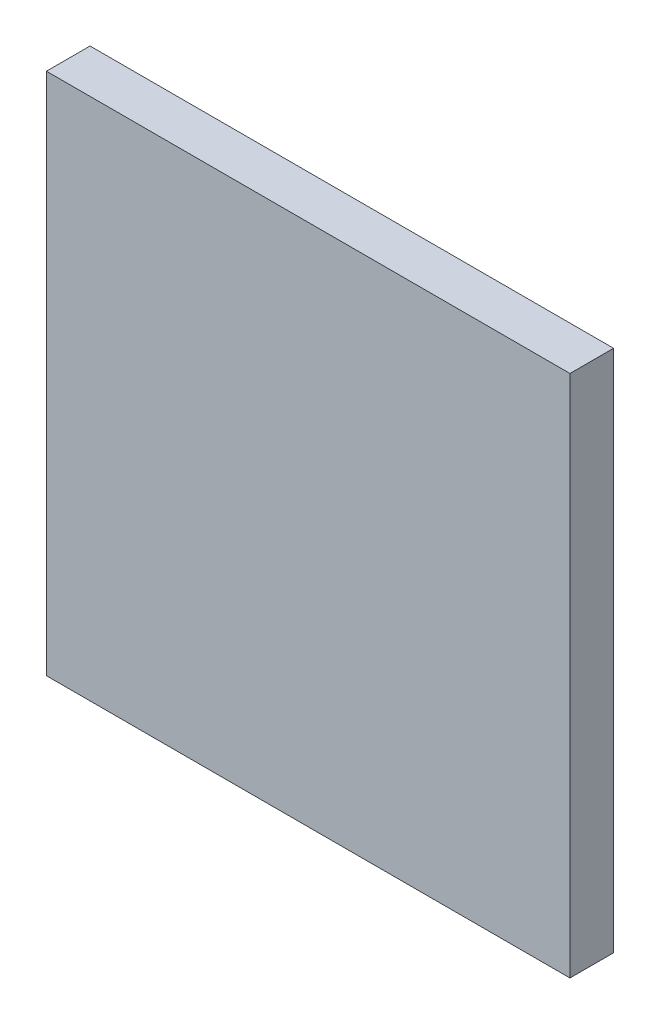
ISO-10303-21;
HEADER;
FILE_DESCRIPTION(('STEP AP214'),'2;1');
FILE_NAME('part.step','',(''),(''),'','','');
FILE_SCHEMA(('AUTOMOTIVE_DESIGN { 1 0 10303 214 1 1 1 1 }'));
ENDSEC;
DATA;
#1=APPLICATION_CONTEXT('core data for automotive mechanical design processes');
#2=APPLICATION_PROTOCOL_DEFINITION('international standard','automotive_design',2000,#1);
#3=PRODUCT_CONTEXT('',#1,'mechanical');
#4=PRODUCT('Part','Part','',(#3));
#5=PRODUCT_RELATED_PRODUCT_CATEGORY('part','',(#4));
#6=PRODUCT_DEFINITION_FORMATION('','',#4);
#7=PRODUCT_DEFINITION_CONTEXT('part definition',#1,'design');
#8=PRODUCT_DEFINITION('design','',#6,#7);
#9=PRODUCT_DEFINITION_SHAPE('','',#8);
#10=(LENGTH_UNIT() NAMED_UNIT(*) SI_UNIT(.MILLI.,.METRE.));
#11=(NAMED_UNIT(*) PLANE_ANGLE_UNIT() SI_UNIT($,.RADIAN.));
#12=(NAMED_UNIT(*) SI_UNIT($,.STERADIAN.) SOLID_ANGLE_UNIT());
#13=UNCERTAINTY_MEASURE_WITH_UNIT(LENGTH_MEASURE(1.E-05),#10,'distance_accuracy_value','');
#14=(GEOMETRIC_REPRESENTATION_CONTEXT(3) GLOBAL_UNCERTAINTY_ASSIGNED_CONTEXT((#13)) GLOBAL_UNIT_ASSIGNED_CONTEXT((#10,
#11,#12)) REPRESENTATION_CONTEXT('',''));
#15=CARTESIAN_POINT('',(0.,0.,0.));
#16=DIRECTION('',(0.,0.,1.));
#17=DIRECTION('',(1.,0.,0.));
#18=AXIS2_PLACEMENT_3D('',#15,#16,#17);
#19=CARTESIAN_POINT('',(0.,0.,10000.));
#20=DIRECTION('',(1.,0.,0.));
#21=DIRECTION('',(0.,0.,-1.));
#22=AXIS2_PLACEMENT_3D('',#19,#20,#21);
#23=PLANE('',#22);
#24=DIRECTION('',(0.,-1.,0.));
#25=VECTOR('',#24,1.);
#26=CARTESIAN_POINT('',(0.,0.,0.));
#27=LINE('',#26,#25);
#28=CARTESIAN_POINT('',(0.,120000.,0.));
#29=VERTEX_POINT('',#28);
#30=CARTESIAN_POINT('',(0.,0.,0.));
#31=VERTEX_POINT('',#30);
#32=EDGE_CURVE('E111',#29,#31,#27,.T.);
#33=ORIENTED_EDGE('',*,*,#32,.T.);
#34=DIRECTION('',(0.,0.,-1.));
#35=VECTOR('',#34,1.);
#36=CARTESIAN_POINT('',(0.,0.,10000.));
#37=LINE('',#36,#35);
#38=CARTESIAN_POINT('',(0.,0.,10000.));
#39=VERTEX_POINT('',#38);
#40=EDGE_CURVE('E11',#39,#31,#37,.T.);
#41=ORIENTED_EDGE('',*,*,#40,.F.);
#42=DIRECTION('',(0.,-1.,0.));
#43=VECTOR('',#42,1.);
#44=CARTESIAN_POINT('',(0.,0.,10000.));
#45=LINE('',#44,#43);
#46=CARTESIAN_POINT('',(0.,120000.,10000.));
#47=VERTEX_POINT('',#46);
#48=EDGE_CURVE('E95',#47,#39,#45,.T.);
#49=ORIENTED_EDGE('',*,*,#48,.F.);
#50=DIRECTION('',(0.,0.,-1.));
#51=VECTOR('',#50,1.);
#52=CARTESIAN_POINT('',(0.,120000.,10000.));
#53=LINE('',#52,#51);
#54=EDGE_CURVE('E107',#47,#29,#53,.T.);
#55=ORIENTED_EDGE('',*,*,#54,.T.);
#56=EDGE_LOOP('',(#33,#41,#49,#55));
#57=FACE_BOUND('',#56,.T.);
#58=ADVANCED_FACE('F43',(#57),#23,.F.);
#59=CARTESIAN_POINT('',(0.,0.,10000.));
#60=DIRECTION('',(0.,1.,0.));
#61=DIRECTION('',(0.,0.,1.));
#62=AXIS2_PLACEMENT_3D('',#59,#60,#61);
#63=PLANE('',#62);
#64=DIRECTION('',(1.,0.,0.));
#65=VECTOR('',#64,1.);
#66=CARTESIAN_POINT('',(0.,0.,0.));
#67=LINE('',#66,#65);
#68=CARTESIAN_POINT('',(120000.,0.,0.));
#69=VERTEX_POINT('',#68);
#70=EDGE_CURVE('E100',#31,#69,#67,.T.);
#71=ORIENTED_EDGE('',*,*,#70,.T.);
#72=DIRECTION('',(0.,0.,-1.));
#73=VECTOR('',#72,1.);
#74=CARTESIAN_POINT('',(120000.,0.,10000.));
#75=LINE('',#74,#73);
#76=CARTESIAN_POINT('',(120000.,0.,10000.));
#77=VERTEX_POINT('',#76);
#78=EDGE_CURVE('E52',#77,#69,#75,.T.);
#79=ORIENTED_EDGE('',*,*,#78,.F.);
#80=DIRECTION('',(1.,0.,0.));
#81=VECTOR('',#80,1.);
#82=CARTESIAN_POINT('',(0.,0.,10000.));
#83=LINE('',#82,#81);
#84=EDGE_CURVE('E90',#39,#77,#83,.T.);
#85=ORIENTED_EDGE('',*,*,#84,.F.);
#86=ORIENTED_EDGE('',*,*,#40,.T.);
#87=EDGE_LOOP('',(#71,#79,#85,#86));
#88=FACE_BOUND('',#87,.T.);
#89=ADVANCED_FACE('F99',(#88),#63,.F.);
#90=CARTESIAN_POINT('',(120000.,0.,10000.));
#91=DIRECTION('',(-1.,0.,0.));
#92=DIRECTION('',(0.,0.,1.));
#93=AXIS2_PLACEMENT_3D('',#90,#91,#92);
#94=PLANE('',#93);
#95=DIRECTION('',(0.,1.,0.));
#96=VECTOR('',#95,1.);
#97=CARTESIAN_POINT('',(120000.,0.,0.));
#98=LINE('',#97,#96);
#99=CARTESIAN_POINT('',(120000.,120000.,0.));
#100=VERTEX_POINT('',#99);
#101=EDGE_CURVE('E77',#69,#100,#98,.T.);
#102=ORIENTED_EDGE('',*,*,#101,.T.);
#103=DIRECTION('',(0.,0.,-1.));
#104=VECTOR('',#103,1.);
#105=CARTESIAN_POINT('',(120000.,120000.,10000.));
#106=LINE('',#105,#104);
#107=CARTESIAN_POINT('',(120000.,120000.,10000.));
#108=VERTEX_POINT('',#107);
#109=EDGE_CURVE('E102',#108,#100,#106,.T.);
#110=ORIENTED_EDGE('',*,*,#109,.F.);
#111=DIRECTION('',(0.,1.,0.));
#112=VECTOR('',#111,1.);
#113=CARTESIAN_POINT('',(120000.,0.,10000.));
#114=LINE('',#113,#112);
#115=EDGE_CURVE('E93',#77,#108,#114,.T.);
#116=ORIENTED_EDGE('',*,*,#115,.F.);
#117=ORIENTED_EDGE('',*,*,#78,.T.);
#118=EDGE_LOOP('',(#102,#110,#116,#117));
#119=FACE_BOUND('',#118,.T.);
#120=ADVANCED_FACE('F103',(#119),#94,.F.);
#121=CARTESIAN_POINT('',(0.,120000.,10000.));
#122=DIRECTION('',(0.,-1.,0.));
#123=DIRECTION('',(0.,0.,-1.));
#124=AXIS2_PLACEMENT_3D('',#121,#122,#123);
#125=PLANE('',#124);
#126=DIRECTION('',(-1.,0.,0.));
#127=VECTOR('',#126,1.);
#128=CARTESIAN_POINT('',(0.,120000.,0.));
#129=LINE('',#128,#127);
#130=EDGE_CURVE('E83',#100,#29,#129,.T.);
#131=ORIENTED_EDGE('',*,*,#130,.T.);
#132=ORIENTED_EDGE('',*,*,#54,.F.);
#133=DIRECTION('',(-1.,0.,0.));
#134=VECTOR('',#133,1.);
#135=CARTESIAN_POINT('',(0.,120000.,10000.));
#136=LINE('',#135,#134);
#137=EDGE_CURVE('E60',#108,#47,#136,.T.);
#138=ORIENTED_EDGE('',*,*,#137,.F.);
#139=ORIENTED_EDGE('',*,*,#109,.T.);
#140=EDGE_LOOP('',(#131,#132,#138,#139));
#141=FACE_BOUND('',#140,.T.);
#142=ADVANCED_FACE('F124',(#141),#125,.F.);
#143=CARTESIAN_POINT('',(0.,0.,10000.));
#144=DIRECTION('',(0.,0.,-1.));
#145=DIRECTION('',(-1.,0.,0.));
#146=AXIS2_PLACEMENT_3D('',#143,#144,#145);
#147=PLANE('',#146);
#148=ORIENTED_EDGE('',*,*,#48,.T.);
#149=ORIENTED_EDGE('',*,*,#84,.T.);
#150=ORIENTED_EDGE('',*,*,#115,.T.);
#151=ORIENTED_EDGE('',*,*,#137,.T.);
#152=EDGE_LOOP('',(#148,#149,#150,#151));
#153=FACE_BOUND('',#152,.T.);
#154=ADVANCED_FACE('F91',(#153),#147,.F.);
#155=CARTESIAN_POINT('',(0.,0.,0.));
#156=DIRECTION('',(0.,0.,-1.));
#157=DIRECTION('',(-1.,0.,0.));
#158=AXIS2_PLACEMENT_3D('',#155,#156,#157);
#159=PLANE('',#158);
#160=ORIENTED_EDGE('',*,*,#32,.F.);
#161=ORIENTED_EDGE('',*,*,#130,.F.);
#162=ORIENTED_EDGE('',*,*,#101,.F.);
#163=ORIENTED_EDGE('',*,*,#70,.F.);
#164=EDGE_LOOP('',(#160,#161,#162,#163));
#165=FACE_BOUND('',#164,.T.);
#166=ADVANCED_FACE('F127',(#165),#159,.T.);
#167=CLOSED_SHELL('',(#58,#89,#120,#142,#154,#166));
#168=MANIFOLD_SOLID_BREP('B2',#167);
#169=ADVANCED_BREP_SHAPE_REPRESENTATION('',(#18,#168),#14);
#170=SHAPE_DEFINITION_REPRESENTATION(#9,#169);
ENDSEC;
END-ISO-10303-21;
